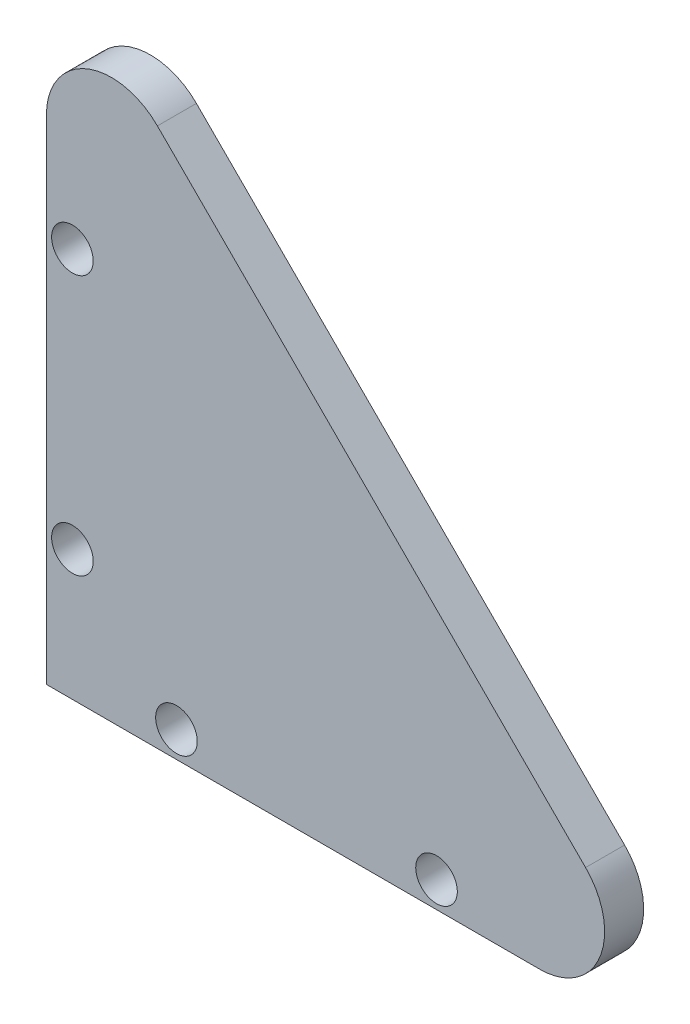
ISO-10303-21;
HEADER;
FILE_DESCRIPTION(('STEP AP214'),'2;1');
FILE_NAME('part.step','',(''),(''),'','','');
FILE_SCHEMA(('AUTOMOTIVE_DESIGN { 1 0 10303 214 1 1 1 1 }'));
ENDSEC;
DATA;
#1=APPLICATION_CONTEXT('core data for automotive mechanical design processes');
#2=APPLICATION_PROTOCOL_DEFINITION('international standard','automotive_design',2000,#1);
#3=PRODUCT_CONTEXT('',#1,'mechanical');
#4=PRODUCT('Part','Part','',(#3));
#5=PRODUCT_RELATED_PRODUCT_CATEGORY('part','',(#4));
#6=PRODUCT_DEFINITION_FORMATION('','',#4);
#7=PRODUCT_DEFINITION_CONTEXT('part definition',#1,'design');
#8=PRODUCT_DEFINITION('design','',#6,#7);
#9=PRODUCT_DEFINITION_SHAPE('','',#8);
#10=(LENGTH_UNIT() NAMED_UNIT(*) SI_UNIT(.MILLI.,.METRE.));
#11=(NAMED_UNIT(*) PLANE_ANGLE_UNIT() SI_UNIT($,.RADIAN.));
#12=(NAMED_UNIT(*) SI_UNIT($,.STERADIAN.) SOLID_ANGLE_UNIT());
#13=UNCERTAINTY_MEASURE_WITH_UNIT(LENGTH_MEASURE(1.E-05),#10,'distance_accuracy_value','');
#14=(GEOMETRIC_REPRESENTATION_CONTEXT(3) GLOBAL_UNCERTAINTY_ASSIGNED_CONTEXT((#13)) GLOBAL_UNIT_ASSIGNED_CONTEXT((#10,
#11,#12)) REPRESENTATION_CONTEXT('',''));
#15=CARTESIAN_POINT('',(0.,0.,0.));
#16=DIRECTION('',(0.,0.,1.));
#17=DIRECTION('',(1.,0.,0.));
#18=AXIS2_PLACEMENT_3D('',#15,#16,#17);
#19=CARTESIAN_POINT('',(-27.9172032002026,22.65625,3.));
#20=DIRECTION('',(-0.707106781186548,-0.707106781186548,0.));
#21=DIRECTION('',(0.707106781186548,-0.707106781186548,0.));
#22=AXIS2_PLACEMENT_3D('',#19,#20,#21);
#23=PLANE('',#22);
#24=DIRECTION('',(-0.707106781186547,0.707106781186547,0.));
#25=VECTOR('',#24,1.);
#26=CARTESIAN_POINT('',(-27.9172032002026,22.65625,3.));
#27=LINE('',#26,#25);
#28=CARTESIAN_POINT('',(13.5472628938646,-18.8082160940672,3.));
#29=VERTEX_POINT('',#28);
#30=CARTESIAN_POINT('',(-19.3816692942699,14.1207160940673,3.));
#31=VERTEX_POINT('',#30);
#32=EDGE_CURVE('E87',#29,#31,#27,.T.);
#33=ORIENTED_EDGE('',*,*,#32,.F.);
#34=DIRECTION('',(0.,0.,-1.));
#35=VECTOR('',#34,1.);
#36=CARTESIAN_POINT('',(13.5472628938646,-18.8082160940672,3.));
#37=LINE('',#36,#35);
#38=CARTESIAN_POINT('',(13.5472628938646,-18.8082160940672,0.));
#39=VERTEX_POINT('',#38);
#40=EDGE_CURVE('E109',#29,#39,#37,.T.);
#41=ORIENTED_EDGE('',*,*,#40,.T.);
#42=DIRECTION('',(-0.707106781186547,0.707106781186547,0.));
#43=VECTOR('',#42,1.);
#44=CARTESIAN_POINT('',(-27.9172032002026,22.65625,0.));
#45=LINE('',#44,#43);
#46=CARTESIAN_POINT('',(-19.3816692942699,14.1207160940673,0.));
#47=VERTEX_POINT('',#46);
#48=EDGE_CURVE('E101',#39,#47,#45,.T.);
#49=ORIENTED_EDGE('',*,*,#48,.T.);
#50=DIRECTION('',(0.,0.,-1.));
#51=VECTOR('',#50,1.);
#52=CARTESIAN_POINT('',(-19.3816692942699,14.1207160940673,3.));
#53=LINE('',#52,#51);
#54=EDGE_CURVE('E95',#47,#31,#53,.F.);
#55=ORIENTED_EDGE('',*,*,#54,.T.);
#56=EDGE_LOOP('',(#33,#41,#49,#55));
#57=FACE_BOUND('',#56,.T.);
#58=ADVANCED_FACE('F33',(#57),#23,.F.);
#59=CARTESIAN_POINT('',(-27.9172032002026,22.65625,3.));
#60=DIRECTION('',(1.,0.,0.));
#61=DIRECTION('',(0.,1.,0.));
#62=AXIS2_PLACEMENT_3D('',#59,#60,#61);
#63=PLANE('',#62);
#64=DIRECTION('',(0.,-1.,0.));
#65=VECTOR('',#64,1.);
#66=CARTESIAN_POINT('',(-27.9172032002026,22.65625,3.));
#67=LINE('',#66,#65);
#68=CARTESIAN_POINT('',(-27.9172032002026,10.5851821881345,3.));
#69=VERTEX_POINT('',#68);
#70=CARTESIAN_POINT('',(-27.9172032002026,-27.34375,3.));
#71=VERTEX_POINT('',#70);
#72=EDGE_CURVE('E80',#69,#71,#67,.T.);
#73=ORIENTED_EDGE('',*,*,#72,.F.);
#74=DIRECTION('',(0.,0.,-1.));
#75=VECTOR('',#74,1.);
#76=CARTESIAN_POINT('',(-27.9172032002026,10.5851821881345,3.));
#77=LINE('',#76,#75);
#78=CARTESIAN_POINT('',(-27.9172032002026,10.5851821881345,0.));
#79=VERTEX_POINT('',#78);
#80=EDGE_CURVE('E11',#69,#79,#77,.T.);
#81=ORIENTED_EDGE('',*,*,#80,.T.);
#82=DIRECTION('',(0.,-1.,0.));
#83=VECTOR('',#82,1.);
#84=CARTESIAN_POINT('',(-27.9172032002026,22.65625,0.));
#85=LINE('',#84,#83);
#86=CARTESIAN_POINT('',(-27.9172032002026,-27.34375,0.));
#87=VERTEX_POINT('',#86);
#88=EDGE_CURVE('E93',#79,#87,#85,.T.);
#89=ORIENTED_EDGE('',*,*,#88,.T.);
#90=DIRECTION('',(0.,0.,-1.));
#91=VECTOR('',#90,1.);
#92=CARTESIAN_POINT('',(-27.9172032002026,-27.34375,3.));
#93=LINE('',#92,#91);
#94=EDGE_CURVE('E90',#71,#87,#93,.T.);
#95=ORIENTED_EDGE('',*,*,#94,.F.);
#96=EDGE_LOOP('',(#73,#81,#89,#95));
#97=FACE_BOUND('',#96,.T.);
#98=ADVANCED_FACE('F91',(#97),#63,.F.);
#99=CARTESIAN_POINT('',(-27.9172032002026,-27.34375,3.));
#100=DIRECTION('',(0.,1.,0.));
#101=DIRECTION('',(0.,0.,1.));
#102=AXIS2_PLACEMENT_3D('',#99,#100,#101);
#103=PLANE('',#102);
#104=DIRECTION('',(1.,0.,0.));
#105=VECTOR('',#104,1.);
#106=CARTESIAN_POINT('',(-27.9172032002026,-27.34375,0.));
#107=LINE('',#106,#105);
#108=CARTESIAN_POINT('',(10.0117289879319,-27.34375,0.));
#109=VERTEX_POINT('',#108);
#110=EDGE_CURVE('E106',#87,#109,#107,.T.);
#111=ORIENTED_EDGE('',*,*,#110,.T.);
#112=DIRECTION('',(0.,0.,-1.));
#113=VECTOR('',#112,1.);
#114=CARTESIAN_POINT('',(10.0117289879319,-27.34375,3.));
#115=LINE('',#114,#113);
#116=CARTESIAN_POINT('',(10.0117289879319,-27.34375,3.));
#117=VERTEX_POINT('',#116);
#118=EDGE_CURVE('E56',#109,#117,#115,.F.);
#119=ORIENTED_EDGE('',*,*,#118,.T.);
#120=DIRECTION('',(1.,0.,0.));
#121=VECTOR('',#120,1.);
#122=CARTESIAN_POINT('',(-27.9172032002026,-27.34375,3.));
#123=LINE('',#122,#121);
#124=EDGE_CURVE('E83',#71,#117,#123,.T.);
#125=ORIENTED_EDGE('',*,*,#124,.F.);
#126=ORIENTED_EDGE('',*,*,#94,.T.);
#127=EDGE_LOOP('',(#111,#119,#125,#126));
#128=FACE_BOUND('',#127,.T.);
#129=ADVANCED_FACE('F97',(#128),#103,.F.);
#130=CARTESIAN_POINT('',(0.,0.,3.));
#131=DIRECTION('',(0.,0.,1.));
#132=DIRECTION('',(1.,0.,0.));
#133=AXIS2_PLACEMENT_3D('',#130,#131,#132);
#134=PLANE('',#133);
#135=CARTESIAN_POINT('',(2.08279679979735,-25.34375,3.));
#136=DIRECTION('',(0.,0.,1.));
#137=DIRECTION('',(-1.,0.,0.));
#138=AXIS2_PLACEMENT_3D('',#135,#136,#137);
#139=CIRCLE('',#138,1.6);
#140=CARTESIAN_POINT('',(0.482796799797355,-25.34375,3.));
#141=VERTEX_POINT('',#140);
#142=EDGE_CURVE('E184',#141,#141,#139,.T.);
#143=ORIENTED_EDGE('',*,*,#142,.F.);
#144=EDGE_LOOP('',(#143));
#145=FACE_BOUND('',#144,.T.);
#146=CARTESIAN_POINT('',(-17.9172032002026,-25.34375,3.));
#147=DIRECTION('',(0.,0.,1.));
#148=DIRECTION('',(-1.,0.,0.));
#149=AXIS2_PLACEMENT_3D('',#146,#147,#148);
#150=CIRCLE('',#149,1.6);
#151=CARTESIAN_POINT('',(-19.5172032002026,-25.34375,3.));
#152=VERTEX_POINT('',#151);
#153=EDGE_CURVE('E176',#152,#152,#150,.T.);
#154=ORIENTED_EDGE('',*,*,#153,.F.);
#155=EDGE_LOOP('',(#154));
#156=FACE_BOUND('',#155,.T.);
#157=CARTESIAN_POINT('',(-25.9172032002026,2.65625000000001,3.));
#158=DIRECTION('',(0.,0.,1.));
#159=DIRECTION('',(1.,0.,0.));
#160=AXIS2_PLACEMENT_3D('',#157,#158,#159);
#161=CIRCLE('',#160,1.6);
#162=CARTESIAN_POINT('',(-24.3172032002026,2.65625000000001,3.));
#163=VERTEX_POINT('',#162);
#164=EDGE_CURVE('E169',#163,#163,#161,.T.);
#165=ORIENTED_EDGE('',*,*,#164,.F.);
#166=EDGE_LOOP('',(#165));
#167=FACE_BOUND('',#166,.T.);
#168=CARTESIAN_POINT('',(-25.9172032002026,-17.34375,3.));
#169=DIRECTION('',(0.,0.,1.));
#170=DIRECTION('',(1.,0.,0.));
#171=AXIS2_PLACEMENT_3D('',#168,#169,#170);
#172=CIRCLE('',#171,1.6);
#173=CARTESIAN_POINT('',(-24.3172032002026,-17.34375,3.));
#174=VERTEX_POINT('',#173);
#175=EDGE_CURVE('E173',#174,#174,#172,.T.);
#176=ORIENTED_EDGE('',*,*,#175,.F.);
#177=EDGE_LOOP('',(#176));
#178=FACE_BOUND('',#177,.T.);
#179=ORIENTED_EDGE('',*,*,#124,.T.);
#180=CARTESIAN_POINT('',(10.0117289879319,-22.34375,3.));
#181=DIRECTION('',(0.,0.,1.));
#182=DIRECTION('',(1.,0.,0.));
#183=AXIS2_PLACEMENT_3D('',#180,#181,#182);
#184=CIRCLE('',#183,5.);
#185=EDGE_CURVE('E41',#117,#29,#184,.T.);
#186=ORIENTED_EDGE('',*,*,#185,.T.);
#187=ORIENTED_EDGE('',*,*,#32,.T.);
#188=CARTESIAN_POINT('',(-22.9172032002026,10.5851821881345,3.));
#189=DIRECTION('',(0.,0.,1.));
#190=DIRECTION('',(1.,0.,0.));
#191=AXIS2_PLACEMENT_3D('',#188,#189,#190);
#192=CIRCLE('',#191,5.);
#193=EDGE_CURVE('E48',#31,#69,#192,.T.);
#194=ORIENTED_EDGE('',*,*,#193,.T.);
#195=ORIENTED_EDGE('',*,*,#72,.T.);
#196=EDGE_LOOP('',(#179,#186,#187,#194,#195));
#197=FACE_BOUND('',#196,.T.);
#198=ADVANCED_FACE('F82',(#145,#156,#167,#178,#197),#134,.T.);
#199=CARTESIAN_POINT('',(0.,0.,0.));
#200=DIRECTION('',(0.,0.,1.));
#201=DIRECTION('',(1.,0.,0.));
#202=AXIS2_PLACEMENT_3D('',#199,#200,#201);
#203=PLANE('',#202);
#204=CARTESIAN_POINT('',(2.08279679979735,-25.34375,0.));
#205=DIRECTION('',(0.,0.,1.));
#206=DIRECTION('',(-1.,0.,0.));
#207=AXIS2_PLACEMENT_3D('',#204,#205,#206);
#208=CIRCLE('',#207,1.6);
#209=CARTESIAN_POINT('',(0.482796799797355,-25.34375,0.));
#210=VERTEX_POINT('',#209);
#211=EDGE_CURVE('E181',#210,#210,#208,.T.);
#212=ORIENTED_EDGE('',*,*,#211,.T.);
#213=EDGE_LOOP('',(#212));
#214=FACE_BOUND('',#213,.T.);
#215=CARTESIAN_POINT('',(-17.9172032002026,-25.34375,0.));
#216=DIRECTION('',(0.,0.,1.));
#217=DIRECTION('',(-1.,0.,0.));
#218=AXIS2_PLACEMENT_3D('',#215,#216,#217);
#219=CIRCLE('',#218,1.6);
#220=CARTESIAN_POINT('',(-19.5172032002026,-25.34375,0.));
#221=VERTEX_POINT('',#220);
#222=EDGE_CURVE('E171',#221,#221,#219,.T.);
#223=ORIENTED_EDGE('',*,*,#222,.T.);
#224=EDGE_LOOP('',(#223));
#225=FACE_BOUND('',#224,.T.);
#226=CARTESIAN_POINT('',(-25.9172032002026,2.65625000000001,0.));
#227=DIRECTION('',(0.,0.,1.));
#228=DIRECTION('',(1.,0.,0.));
#229=AXIS2_PLACEMENT_3D('',#226,#227,#228);
#230=CIRCLE('',#229,1.6);
#231=CARTESIAN_POINT('',(-24.3172032002026,2.65625000000001,0.));
#232=VERTEX_POINT('',#231);
#233=EDGE_CURVE('E166',#232,#232,#230,.T.);
#234=ORIENTED_EDGE('',*,*,#233,.T.);
#235=EDGE_LOOP('',(#234));
#236=FACE_BOUND('',#235,.T.);
#237=CARTESIAN_POINT('',(-25.9172032002026,-17.34375,0.));
#238=DIRECTION('',(0.,0.,1.));
#239=DIRECTION('',(1.,0.,0.));
#240=AXIS2_PLACEMENT_3D('',#237,#238,#239);
#241=CIRCLE('',#240,1.6);
#242=CARTESIAN_POINT('',(-24.3172032002026,-17.34375,0.));
#243=VERTEX_POINT('',#242);
#244=EDGE_CURVE('E104',#243,#243,#241,.T.);
#245=ORIENTED_EDGE('',*,*,#244,.T.);
#246=EDGE_LOOP('',(#245));
#247=FACE_BOUND('',#246,.T.);
#248=ORIENTED_EDGE('',*,*,#48,.F.);
#249=CARTESIAN_POINT('',(10.0117289879319,-22.34375,0.));
#250=DIRECTION('',(0.,0.,1.));
#251=DIRECTION('',(1.,0.,0.));
#252=AXIS2_PLACEMENT_3D('',#249,#250,#251);
#253=CIRCLE('',#252,5.);
#254=EDGE_CURVE('E114',#39,#109,#253,.F.);
#255=ORIENTED_EDGE('',*,*,#254,.T.);
#256=ORIENTED_EDGE('',*,*,#110,.F.);
#257=ORIENTED_EDGE('',*,*,#88,.F.);
#258=CARTESIAN_POINT('',(-22.9172032002026,10.5851821881345,0.));
#259=DIRECTION('',(0.,0.,1.));
#260=DIRECTION('',(1.,0.,0.));
#261=AXIS2_PLACEMENT_3D('',#258,#259,#260);
#262=CIRCLE('',#261,5.);
#263=EDGE_CURVE('E112',#79,#47,#262,.F.);
#264=ORIENTED_EDGE('',*,*,#263,.T.);
#265=EDGE_LOOP('',(#248,#255,#256,#257,#264));
#266=FACE_BOUND('',#265,.T.);
#267=ADVANCED_FACE('F125',(#214,#225,#236,#247,#266),#203,.F.);
#268=CARTESIAN_POINT('',(-25.9172032002026,-17.34375,0.));
#269=DIRECTION('',(0.,0.,1.));
#270=DIRECTION('',(1.,0.,0.));
#271=AXIS2_PLACEMENT_3D('',#268,#269,#270);
#272=CYLINDRICAL_SURFACE('',#271,1.6);
#273=ORIENTED_EDGE('',*,*,#244,.F.);
#274=EDGE_LOOP('',(#273));
#275=FACE_BOUND('',#274,.T.);
#276=ORIENTED_EDGE('',*,*,#175,.T.);
#277=EDGE_LOOP('',(#276));
#278=FACE_BOUND('',#277,.T.);
#279=ADVANCED_FACE('F143',(#275,#278),#272,.F.);
#280=CARTESIAN_POINT('',(-25.9172032002026,2.65625000000001,0.));
#281=DIRECTION('',(0.,0.,1.));
#282=DIRECTION('',(1.,0.,0.));
#283=AXIS2_PLACEMENT_3D('',#280,#281,#282);
#284=CYLINDRICAL_SURFACE('',#283,1.6);
#285=ORIENTED_EDGE('',*,*,#233,.F.);
#286=EDGE_LOOP('',(#285));
#287=FACE_BOUND('',#286,.T.);
#288=ORIENTED_EDGE('',*,*,#164,.T.);
#289=EDGE_LOOP('',(#288));
#290=FACE_BOUND('',#289,.T.);
#291=ADVANCED_FACE('F150',(#287,#290),#284,.F.);
#292=CARTESIAN_POINT('',(-17.9172032002026,-25.34375,0.));
#293=DIRECTION('',(0.,0.,1.));
#294=DIRECTION('',(1.,0.,0.));
#295=AXIS2_PLACEMENT_3D('',#292,#293,#294);
#296=CYLINDRICAL_SURFACE('',#295,1.6);
#297=ORIENTED_EDGE('',*,*,#222,.F.);
#298=EDGE_LOOP('',(#297));
#299=FACE_BOUND('',#298,.T.);
#300=ORIENTED_EDGE('',*,*,#153,.T.);
#301=EDGE_LOOP('',(#300));
#302=FACE_BOUND('',#301,.T.);
#303=ADVANCED_FACE('F154',(#299,#302),#296,.F.);
#304=CARTESIAN_POINT('',(2.08279679979735,-25.34375,0.));
#305=DIRECTION('',(0.,0.,1.));
#306=DIRECTION('',(1.,0.,0.));
#307=AXIS2_PLACEMENT_3D('',#304,#305,#306);
#308=CYLINDRICAL_SURFACE('',#307,1.6);
#309=ORIENTED_EDGE('',*,*,#211,.F.);
#310=EDGE_LOOP('',(#309));
#311=FACE_BOUND('',#310,.T.);
#312=ORIENTED_EDGE('',*,*,#142,.T.);
#313=EDGE_LOOP('',(#312));
#314=FACE_BOUND('',#313,.T.);
#315=ADVANCED_FACE('F131',(#311,#314),#308,.F.);
#316=CARTESIAN_POINT('',(10.0117289879319,-22.34375,3.));
#317=DIRECTION('',(0.,0.,-1.));
#318=DIRECTION('',(-1.,0.,0.));
#319=AXIS2_PLACEMENT_3D('',#316,#317,#318);
#320=CYLINDRICAL_SURFACE('',#319,5.);
#321=ORIENTED_EDGE('',*,*,#185,.F.);
#322=ORIENTED_EDGE('',*,*,#118,.F.);
#323=ORIENTED_EDGE('',*,*,#254,.F.);
#324=ORIENTED_EDGE('',*,*,#40,.F.);
#325=EDGE_LOOP('',(#321,#322,#323,#324));
#326=FACE_BOUND('',#325,.T.);
#327=ADVANCED_FACE('F123',(#326),#320,.T.);
#328=CARTESIAN_POINT('',(-22.9172032002026,10.5851821881345,3.));
#329=DIRECTION('',(0.,0.,-1.));
#330=DIRECTION('',(-1.,0.,0.));
#331=AXIS2_PLACEMENT_3D('',#328,#329,#330);
#332=CYLINDRICAL_SURFACE('',#331,5.);
#333=ORIENTED_EDGE('',*,*,#193,.F.);
#334=ORIENTED_EDGE('',*,*,#54,.F.);
#335=ORIENTED_EDGE('',*,*,#263,.F.);
#336=ORIENTED_EDGE('',*,*,#80,.F.);
#337=EDGE_LOOP('',(#333,#334,#335,#336));
#338=FACE_BOUND('',#337,.T.);
#339=ADVANCED_FACE('F35',(#338),#332,.T.);
#340=CLOSED_SHELL('',(#58,#98,#129,#198,#267,#279,#291,#303,#315,#327,#339));
#341=MANIFOLD_SOLID_BREP('B2',#340);
#342=ADVANCED_BREP_SHAPE_REPRESENTATION('',(#18,#341),#14);
#343=SHAPE_DEFINITION_REPRESENTATION(#9,#342);
ENDSEC;
END-ISO-10303-21;
